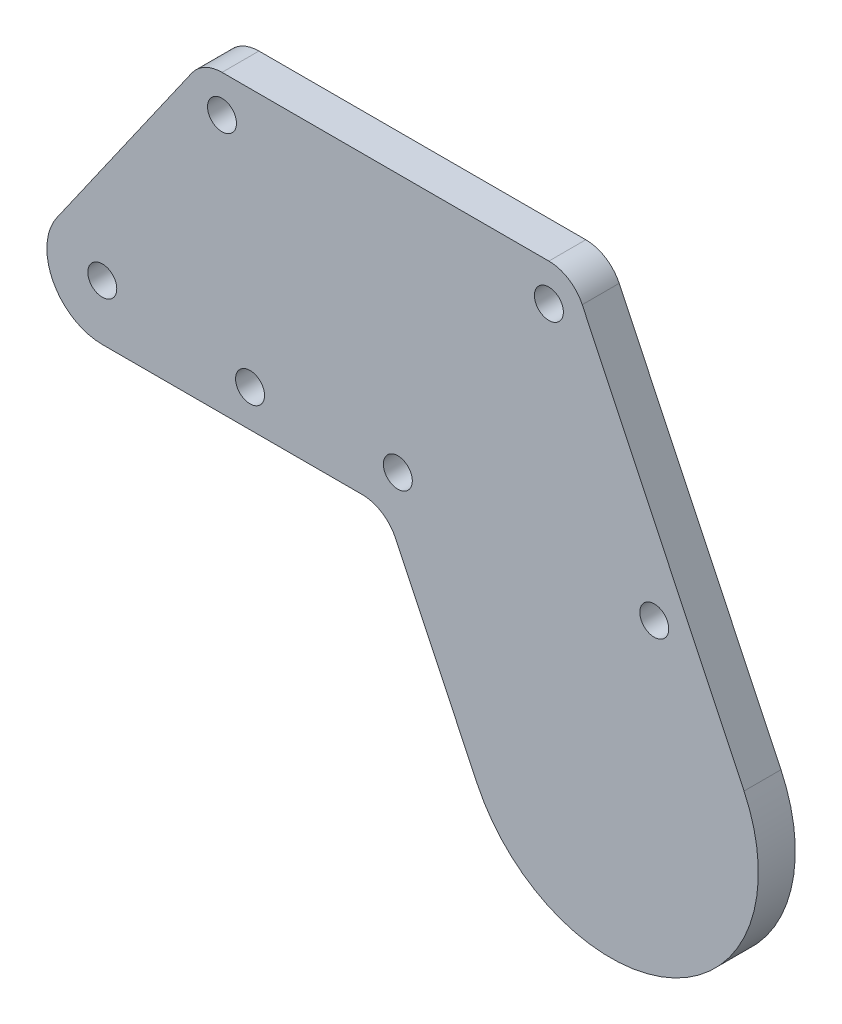
ISO-10303-21;
HEADER;
FILE_DESCRIPTION(('STEP AP214'),'2;1');
FILE_NAME('part.step','',(''),(''),'','','');
FILE_SCHEMA(('AUTOMOTIVE_DESIGN { 1 0 10303 214 1 1 1 1 }'));
ENDSEC;
DATA;
#1=APPLICATION_CONTEXT('core data for automotive mechanical design processes');
#2=APPLICATION_PROTOCOL_DEFINITION('international standard','automotive_design',2000,#1);
#3=PRODUCT_CONTEXT('',#1,'mechanical');
#4=PRODUCT('Part','Part','',(#3));
#5=PRODUCT_RELATED_PRODUCT_CATEGORY('part','',(#4));
#6=PRODUCT_DEFINITION_FORMATION('','',#4);
#7=PRODUCT_DEFINITION_CONTEXT('part definition',#1,'design');
#8=PRODUCT_DEFINITION('design','',#6,#7);
#9=PRODUCT_DEFINITION_SHAPE('','',#8);
#10=(LENGTH_UNIT() NAMED_UNIT(*) SI_UNIT(.MILLI.,.METRE.));
#11=(NAMED_UNIT(*) PLANE_ANGLE_UNIT() SI_UNIT($,.RADIAN.));
#12=(NAMED_UNIT(*) SI_UNIT($,.STERADIAN.) SOLID_ANGLE_UNIT());
#13=UNCERTAINTY_MEASURE_WITH_UNIT(LENGTH_MEASURE(1.E-05),#10,'distance_accuracy_value','');
#14=(GEOMETRIC_REPRESENTATION_CONTEXT(3) GLOBAL_UNCERTAINTY_ASSIGNED_CONTEXT((#13)) GLOBAL_UNIT_ASSIGNED_CONTEXT((#10,
#11,#12)) REPRESENTATION_CONTEXT('',''));
#15=CARTESIAN_POINT('',(0.,0.,0.));
#16=DIRECTION('',(0.,0.,1.));
#17=DIRECTION('',(1.,0.,0.));
#18=AXIS2_PLACEMENT_3D('',#15,#16,#17);
#19=CARTESIAN_POINT('',(569.9125,88.8999999999999,6.35));
#20=DIRECTION('',(0.,0.,1.));
#21=DIRECTION('',(1.,0.,0.));
#22=AXIS2_PLACEMENT_3D('',#19,#20,#21);
#23=PLANE('',#22);
#24=CARTESIAN_POINT('',(577.420232252986,117.475000000009,6.35));
#25=DIRECTION('',(0.,0.,1.));
#26=DIRECTION('',(1.,0.,0.));
#27=AXIS2_PLACEMENT_3D('',#24,#25,#26);
#28=CIRCLE('',#27,2.48919999999995);
#29=CARTESIAN_POINT('',(579.909432252986,117.475000000009,6.35));
#30=VERTEX_POINT('',#29);
#31=EDGE_CURVE('E240',#30,#30,#28,.T.);
#32=ORIENTED_EDGE('',*,*,#31,.F.);
#33=EDGE_LOOP('',(#32));
#34=FACE_BOUND('',#33,.T.);
#35=CARTESIAN_POINT('',(559.305908905092,155.575000002593,6.35));
#36=DIRECTION('',(0.,0.,1.));
#37=DIRECTION('',(1.,0.,0.));
#38=AXIS2_PLACEMENT_3D('',#35,#36,#37);
#39=CIRCLE('',#38,2.48919999999995);
#40=CARTESIAN_POINT('',(561.795108905092,155.575000002593,6.35));
#41=VERTEX_POINT('',#40);
#42=EDGE_CURVE('E228',#41,#41,#39,.T.);
#43=ORIENTED_EDGE('',*,*,#42,.F.);
#44=EDGE_LOOP('',(#43));
#45=FACE_BOUND('',#44,.T.);
#46=CARTESIAN_POINT('',(482.544825084848,120.650000000009,6.35));
#47=DIRECTION('',(0.,0.,1.));
#48=DIRECTION('',(1.,0.,0.));
#49=AXIS2_PLACEMENT_3D('',#46,#47,#48);
#50=CIRCLE('',#49,2.48920000000001);
#51=CARTESIAN_POINT('',(485.034025084848,120.650000000009,6.35));
#52=VERTEX_POINT('',#51);
#53=EDGE_CURVE('E156',#52,#52,#50,.T.);
#54=ORIENTED_EDGE('',*,*,#53,.F.);
#55=EDGE_LOOP('',(#54));
#56=FACE_BOUND('',#55,.T.);
#57=CARTESIAN_POINT('',(569.9125,88.8999999999999,6.35));
#58=DIRECTION('',(0.,0.,1.));
#59=DIRECTION('',(1.,0.,0.));
#60=AXIS2_PLACEMENT_3D('',#57,#58,#59);
#61=CIRCLE('',#60,25.4000000000025);
#62=CARTESIAN_POINT('',(546.973178459246,77.9936932351045,6.35));
#63=VERTEX_POINT('',#62);
#64=CARTESIAN_POINT('',(592.851821540755,99.8063067648954,6.35));
#65=VERTEX_POINT('',#64);
#66=EDGE_CURVE('E171',#63,#65,#61,.T.);
#67=ORIENTED_EDGE('',*,*,#66,.T.);
#68=DIRECTION('',(-0.429382156098203,0.903122895305206,0.));
#69=VECTOR('',#68,1.);
#70=CARTESIAN_POINT('',(592.851821540755,99.8063067648954,6.35));
#71=LINE('',#70,#69);
#72=CARTESIAN_POINT('',(565.040739290274,158.301576693813,6.35));
#73=VERTEX_POINT('',#72);
#74=EDGE_CURVE('E109',#65,#73,#71,.T.);
#75=ORIENTED_EDGE('',*,*,#74,.T.);
#76=CARTESIAN_POINT('',(559.305908905092,155.575000002593,6.35));
#77=DIRECTION('',(0.,0.,1.));
#78=DIRECTION('',(1.,0.,0.));
#79=AXIS2_PLACEMENT_3D('',#76,#77,#78);
#80=CIRCLE('',#79,6.34999999999367);
#81=CARTESIAN_POINT('',(559.305908905092,161.925000002586,6.35));
#82=VERTEX_POINT('',#81);
#83=EDGE_CURVE('E192',#73,#82,#80,.T.);
#84=ORIENTED_EDGE('',*,*,#83,.T.);
#85=DIRECTION('',(-1.,0.,0.));
#86=VECTOR('',#85,1.);
#87=CARTESIAN_POINT('',(559.305908905092,161.925000002586,6.35));
#88=LINE('',#87,#86);
#89=CARTESIAN_POINT('',(503.123614039306,161.925000002586,6.35));
#90=VERTEX_POINT('',#89);
#91=EDGE_CURVE('E211',#82,#90,#88,.T.);
#92=ORIENTED_EDGE('',*,*,#91,.T.);
#93=CARTESIAN_POINT('',(503.123614039306,155.575000002593,6.35));
#94=DIRECTION('',(0.,0.,1.));
#95=DIRECTION('',(1.,0.,0.));
#96=AXIS2_PLACEMENT_3D('',#93,#94,#95);
#97=CIRCLE('',#96,6.34999999999361);
#98=CARTESIAN_POINT('',(497.921998558076,159.217210373418,6.35));
#99=VERTEX_POINT('',#98);
#100=EDGE_CURVE('E208',#90,#99,#97,.T.);
#101=ORIENTED_EDGE('',*,*,#100,.T.);
#102=DIRECTION('',(-0.57357643635105,-0.819152044288989,0.));
#103=VECTOR('',#102,1.);
#104=CARTESIAN_POINT('',(497.921998558076,159.217210373418,6.35));
#105=LINE('',#104,#103);
#106=CARTESIAN_POINT('',(474.742401862995,126.113315556252,6.35));
#107=VERTEX_POINT('',#106);
#108=EDGE_CURVE('E210',#99,#107,#105,.T.);
#109=ORIENTED_EDGE('',*,*,#108,.T.);
#110=CARTESIAN_POINT('',(482.544825084848,120.650000000009,6.35));
#111=DIRECTION('',(0.,0.,1.));
#112=DIRECTION('',(1.,0.,0.));
#113=AXIS2_PLACEMENT_3D('',#110,#111,#112);
#114=CIRCLE('',#113,9.52500000000004);
#115=CARTESIAN_POINT('',(482.544825084848,111.125000000009,6.35));
#116=VERTEX_POINT('',#115);
#117=EDGE_CURVE('E134',#107,#116,#114,.T.);
#118=ORIENTED_EDGE('',*,*,#117,.T.);
#119=DIRECTION('',(1.,0.,0.));
#120=VECTOR('',#119,1.);
#121=CARTESIAN_POINT('',(482.544825084848,111.125000000009,6.35));
#122=LINE('',#121,#120);
#123=CARTESIAN_POINT('',(527.209074000565,111.125000000009,6.35));
#124=VERTEX_POINT('',#123);
#125=EDGE_CURVE('E128',#116,#124,#122,.T.);
#126=ORIENTED_EDGE('',*,*,#125,.T.);
#127=CARTESIAN_POINT('',(527.209074000564,104.775000000015,6.35));
#128=DIRECTION('',(0.,0.,-1.));
#129=DIRECTION('',(1.,0.,0.));
#130=AXIS2_PLACEMENT_3D('',#127,#128,#129);
#131=CIRCLE('',#130,6.34999999999369);
#132=CARTESIAN_POINT('',(532.943904385747,107.501576691236,6.35));
#133=VERTEX_POINT('',#132);
#134=EDGE_CURVE('E132',#124,#133,#131,.T.);
#135=ORIENTED_EDGE('',*,*,#134,.T.);
#136=DIRECTION('',(0.429382156098212,-0.903122895305202,0.));
#137=VECTOR('',#136,1.);
#138=CARTESIAN_POINT('',(532.943904385747,107.501576691236,6.35));
#139=LINE('',#138,#137);
#140=EDGE_CURVE('E60',#133,#63,#139,.T.);
#141=ORIENTED_EDGE('',*,*,#140,.T.);
#142=EDGE_LOOP('',(#67,#75,#84,#92,#101,#109,#118,#126,#135,#141));
#143=FACE_BOUND('',#142,.T.);
#144=CARTESIAN_POINT('',(503.123614039306,155.575000002593,6.35));
#145=DIRECTION('',(0.,0.,1.));
#146=DIRECTION('',(1.,0.,0.));
#147=AXIS2_PLACEMENT_3D('',#144,#145,#146);
#148=CIRCLE('',#147,2.48919999999995);
#149=CARTESIAN_POINT('',(505.612814039306,155.575000002593,6.35));
#150=VERTEX_POINT('',#149);
#151=EDGE_CURVE('E222',#150,#150,#148,.T.);
#152=ORIENTED_EDGE('',*,*,#151,.F.);
#153=EDGE_LOOP('',(#152));
#154=FACE_BOUND('',#153,.T.);
#155=CARTESIAN_POINT('',(533.344825084848,117.475000000009,6.35));
#156=DIRECTION('',(0.,0.,1.));
#157=DIRECTION('',(1.,0.,0.));
#158=AXIS2_PLACEMENT_3D('',#155,#156,#157);
#159=CIRCLE('',#158,2.48919999999995);
#160=CARTESIAN_POINT('',(535.834025084848,117.475000000009,6.35));
#161=VERTEX_POINT('',#160);
#162=EDGE_CURVE('E234',#161,#161,#159,.T.);
#163=ORIENTED_EDGE('',*,*,#162,.F.);
#164=EDGE_LOOP('',(#163));
#165=FACE_BOUND('',#164,.T.);
#166=CARTESIAN_POINT('',(507.944825084848,117.475000000009,6.35));
#167=DIRECTION('',(0.,0.,1.));
#168=DIRECTION('',(1.,0.,0.));
#169=AXIS2_PLACEMENT_3D('',#166,#167,#168);
#170=CIRCLE('',#169,2.48919999999995);
#171=CARTESIAN_POINT('',(510.434025084848,117.475000000009,6.35));
#172=VERTEX_POINT('',#171);
#173=EDGE_CURVE('E246',#172,#172,#170,.T.);
#174=ORIENTED_EDGE('',*,*,#173,.F.);
#175=EDGE_LOOP('',(#174));
#176=FACE_BOUND('',#175,.T.);
#177=ADVANCED_FACE('F43',(#34,#45,#56,#143,#154,#165,#176),#23,.T.);
#178=CARTESIAN_POINT('',(569.9125,88.8999999999999,0.));
#179=DIRECTION('',(0.,0.,1.));
#180=DIRECTION('',(1.,0.,0.));
#181=AXIS2_PLACEMENT_3D('',#178,#179,#180);
#182=PLANE('',#181);
#183=CARTESIAN_POINT('',(569.9125,88.8999999999999,0.));
#184=DIRECTION('',(0.,0.,1.));
#185=DIRECTION('',(1.,0.,0.));
#186=AXIS2_PLACEMENT_3D('',#183,#184,#185);
#187=CIRCLE('',#186,25.4000000000025);
#188=CARTESIAN_POINT('',(546.973178459246,77.9936932351045,0.));
#189=VERTEX_POINT('',#188);
#190=CARTESIAN_POINT('',(592.851821540755,99.8063067648954,0.));
#191=VERTEX_POINT('',#190);
#192=EDGE_CURVE('E152',#189,#191,#187,.T.);
#193=ORIENTED_EDGE('',*,*,#192,.F.);
#194=DIRECTION('',(0.429382156098212,-0.903122895305202,0.));
#195=VECTOR('',#194,1.);
#196=CARTESIAN_POINT('',(532.943904385747,107.501576691236,0.));
#197=LINE('',#196,#195);
#198=CARTESIAN_POINT('',(532.943904385747,107.501576691236,0.));
#199=VERTEX_POINT('',#198);
#200=EDGE_CURVE('E101',#199,#189,#197,.T.);
#201=ORIENTED_EDGE('',*,*,#200,.F.);
#202=CARTESIAN_POINT('',(527.209074000564,104.775000000015,0.));
#203=DIRECTION('',(0.,0.,-1.));
#204=DIRECTION('',(1.,0.,0.));
#205=AXIS2_PLACEMENT_3D('',#202,#203,#204);
#206=CIRCLE('',#205,6.34999999999369);
#207=CARTESIAN_POINT('',(527.209074000565,111.125000000009,0.));
#208=VERTEX_POINT('',#207);
#209=EDGE_CURVE('E95',#208,#199,#206,.T.);
#210=ORIENTED_EDGE('',*,*,#209,.F.);
#211=DIRECTION('',(1.,0.,0.));
#212=VECTOR('',#211,1.);
#213=CARTESIAN_POINT('',(482.544825084848,111.125000000009,0.));
#214=LINE('',#213,#212);
#215=CARTESIAN_POINT('',(482.544825084848,111.125000000009,0.));
#216=VERTEX_POINT('',#215);
#217=EDGE_CURVE('E142',#216,#208,#214,.T.);
#218=ORIENTED_EDGE('',*,*,#217,.F.);
#219=CARTESIAN_POINT('',(482.544825084848,120.650000000009,0.));
#220=DIRECTION('',(0.,0.,1.));
#221=DIRECTION('',(1.,0.,0.));
#222=AXIS2_PLACEMENT_3D('',#219,#220,#221);
#223=CIRCLE('',#222,9.52500000000004);
#224=CARTESIAN_POINT('',(474.742401862995,126.113315556252,0.));
#225=VERTEX_POINT('',#224);
#226=EDGE_CURVE('E166',#225,#216,#223,.T.);
#227=ORIENTED_EDGE('',*,*,#226,.F.);
#228=DIRECTION('',(-0.57357643635105,-0.819152044288989,0.));
#229=VECTOR('',#228,1.);
#230=CARTESIAN_POINT('',(497.921998558076,159.217210373418,0.));
#231=LINE('',#230,#229);
#232=CARTESIAN_POINT('',(497.921998558076,159.217210373418,0.));
#233=VERTEX_POINT('',#232);
#234=EDGE_CURVE('E164',#233,#225,#231,.T.);
#235=ORIENTED_EDGE('',*,*,#234,.F.);
#236=CARTESIAN_POINT('',(503.123614039306,155.575000002593,0.));
#237=DIRECTION('',(0.,0.,1.));
#238=DIRECTION('',(1.,0.,0.));
#239=AXIS2_PLACEMENT_3D('',#236,#237,#238);
#240=CIRCLE('',#239,6.34999999999361);
#241=CARTESIAN_POINT('',(503.123614039306,161.925000002586,0.));
#242=VERTEX_POINT('',#241);
#243=EDGE_CURVE('E162',#242,#233,#240,.T.);
#244=ORIENTED_EDGE('',*,*,#243,.F.);
#245=DIRECTION('',(-1.,0.,0.));
#246=VECTOR('',#245,1.);
#247=CARTESIAN_POINT('',(559.305908905092,161.925000002586,0.));
#248=LINE('',#247,#246);
#249=CARTESIAN_POINT('',(559.305908905092,161.925000002586,0.));
#250=VERTEX_POINT('',#249);
#251=EDGE_CURVE('E160',#250,#242,#248,.T.);
#252=ORIENTED_EDGE('',*,*,#251,.F.);
#253=CARTESIAN_POINT('',(559.305908905092,155.575000002593,0.));
#254=DIRECTION('',(0.,0.,1.));
#255=DIRECTION('',(1.,0.,0.));
#256=AXIS2_PLACEMENT_3D('',#253,#254,#255);
#257=CIRCLE('',#256,6.34999999999367);
#258=CARTESIAN_POINT('',(565.040739290274,158.301576693813,0.));
#259=VERTEX_POINT('',#258);
#260=EDGE_CURVE('E158',#259,#250,#257,.T.);
#261=ORIENTED_EDGE('',*,*,#260,.F.);
#262=DIRECTION('',(-0.429382156098203,0.903122895305206,0.));
#263=VECTOR('',#262,1.);
#264=CARTESIAN_POINT('',(592.851821540755,99.8063067648954,0.));
#265=LINE('',#264,#263);
#266=EDGE_CURVE('E155',#191,#259,#265,.T.);
#267=ORIENTED_EDGE('',*,*,#266,.F.);
#268=EDGE_LOOP('',(#193,#201,#210,#218,#227,#235,#244,#252,#261,#267));
#269=FACE_BOUND('',#268,.T.);
#270=CARTESIAN_POINT('',(482.544825084848,120.650000000009,0.));
#271=DIRECTION('',(0.,0.,1.));
#272=DIRECTION('',(1.,0.,0.));
#273=AXIS2_PLACEMENT_3D('',#270,#271,#272);
#274=CIRCLE('',#273,2.48920000000001);
#275=CARTESIAN_POINT('',(485.034025084848,120.650000000009,0.));
#276=VERTEX_POINT('',#275);
#277=EDGE_CURVE('E219',#276,#276,#274,.T.);
#278=ORIENTED_EDGE('',*,*,#277,.T.);
#279=EDGE_LOOP('',(#278));
#280=FACE_BOUND('',#279,.T.);
#281=CARTESIAN_POINT('',(503.123614039306,155.575000002593,0.));
#282=DIRECTION('',(0.,0.,1.));
#283=DIRECTION('',(1.,0.,0.));
#284=AXIS2_PLACEMENT_3D('',#281,#282,#283);
#285=CIRCLE('',#284,2.48919999999995);
#286=CARTESIAN_POINT('',(505.612814039306,155.575000002593,0.));
#287=VERTEX_POINT('',#286);
#288=EDGE_CURVE('E225',#287,#287,#285,.T.);
#289=ORIENTED_EDGE('',*,*,#288,.T.);
#290=EDGE_LOOP('',(#289));
#291=FACE_BOUND('',#290,.T.);
#292=CARTESIAN_POINT('',(559.305908905092,155.575000002593,0.));
#293=DIRECTION('',(0.,0.,1.));
#294=DIRECTION('',(1.,0.,0.));
#295=AXIS2_PLACEMENT_3D('',#292,#293,#294);
#296=CIRCLE('',#295,2.48919999999995);
#297=CARTESIAN_POINT('',(561.795108905092,155.575000002593,0.));
#298=VERTEX_POINT('',#297);
#299=EDGE_CURVE('E231',#298,#298,#296,.T.);
#300=ORIENTED_EDGE('',*,*,#299,.T.);
#301=EDGE_LOOP('',(#300));
#302=FACE_BOUND('',#301,.T.);
#303=CARTESIAN_POINT('',(533.344825084848,117.475000000009,0.));
#304=DIRECTION('',(0.,0.,1.));
#305=DIRECTION('',(1.,0.,0.));
#306=AXIS2_PLACEMENT_3D('',#303,#304,#305);
#307=CIRCLE('',#306,2.48919999999995);
#308=CARTESIAN_POINT('',(535.834025084848,117.475000000009,0.));
#309=VERTEX_POINT('',#308);
#310=EDGE_CURVE('E237',#309,#309,#307,.T.);
#311=ORIENTED_EDGE('',*,*,#310,.T.);
#312=EDGE_LOOP('',(#311));
#313=FACE_BOUND('',#312,.T.);
#314=CARTESIAN_POINT('',(577.420232252986,117.475000000009,0.));
#315=DIRECTION('',(0.,0.,1.));
#316=DIRECTION('',(1.,0.,0.));
#317=AXIS2_PLACEMENT_3D('',#314,#315,#316);
#318=CIRCLE('',#317,2.48919999999995);
#319=CARTESIAN_POINT('',(579.909432252986,117.475000000009,0.));
#320=VERTEX_POINT('',#319);
#321=EDGE_CURVE('E243',#320,#320,#318,.T.);
#322=ORIENTED_EDGE('',*,*,#321,.T.);
#323=EDGE_LOOP('',(#322));
#324=FACE_BOUND('',#323,.T.);
#325=CARTESIAN_POINT('',(507.944825084848,117.475000000009,0.));
#326=DIRECTION('',(0.,0.,1.));
#327=DIRECTION('',(1.,0.,0.));
#328=AXIS2_PLACEMENT_3D('',#325,#326,#327);
#329=CIRCLE('',#328,2.48919999999995);
#330=CARTESIAN_POINT('',(510.434025084848,117.475000000009,0.));
#331=VERTEX_POINT('',#330);
#332=EDGE_CURVE('E249',#331,#331,#329,.T.);
#333=ORIENTED_EDGE('',*,*,#332,.T.);
#334=EDGE_LOOP('',(#333));
#335=FACE_BOUND('',#334,.T.);
#336=ADVANCED_FACE('F196',(#269,#280,#291,#302,#313,#324,#335),#182,.F.);
#337=CARTESIAN_POINT('',(569.9125,88.8999999999999,6.35));
#338=DIRECTION('',(0.,0.,-1.));
#339=DIRECTION('',(-1.,0.,0.));
#340=AXIS2_PLACEMENT_3D('',#337,#338,#339);
#341=CYLINDRICAL_SURFACE('',#340,25.4000000000025);
#342=ORIENTED_EDGE('',*,*,#192,.T.);
#343=DIRECTION('',(0.,0.,-1.));
#344=VECTOR('',#343,1.);
#345=CARTESIAN_POINT('',(592.851821540755,99.8063067648954,6.35));
#346=LINE('',#345,#344);
#347=EDGE_CURVE('E11',#65,#191,#346,.T.);
#348=ORIENTED_EDGE('',*,*,#347,.F.);
#349=ORIENTED_EDGE('',*,*,#66,.F.);
#350=DIRECTION('',(0.,0.,-1.));
#351=VECTOR('',#350,1.);
#352=CARTESIAN_POINT('',(546.973178459246,77.9936932351045,6.35));
#353=LINE('',#352,#351);
#354=EDGE_CURVE('E148',#63,#189,#353,.T.);
#355=ORIENTED_EDGE('',*,*,#354,.T.);
#356=EDGE_LOOP('',(#342,#348,#349,#355));
#357=FACE_BOUND('',#356,.T.);
#358=ADVANCED_FACE('F45',(#357),#341,.T.);
#359=CARTESIAN_POINT('',(592.851821540755,99.8063067648954,6.35));
#360=DIRECTION('',(-0.903122895305206,-0.429382156098203,0.));
#361=DIRECTION('',(0.429382156098203,-0.903122895305206,0.));
#362=AXIS2_PLACEMENT_3D('',#359,#360,#361);
#363=PLANE('',#362);
#364=ORIENTED_EDGE('',*,*,#266,.T.);
#365=DIRECTION('',(0.,0.,-1.));
#366=VECTOR('',#365,1.);
#367=CARTESIAN_POINT('',(565.040739290274,158.301576693813,6.35));
#368=LINE('',#367,#366);
#369=EDGE_CURVE('E52',#73,#259,#368,.T.);
#370=ORIENTED_EDGE('',*,*,#369,.F.);
#371=ORIENTED_EDGE('',*,*,#74,.F.);
#372=ORIENTED_EDGE('',*,*,#347,.T.);
#373=EDGE_LOOP('',(#364,#370,#371,#372));
#374=FACE_BOUND('',#373,.T.);
#375=ADVANCED_FACE('F291',(#374),#363,.F.);
#376=CARTESIAN_POINT('',(559.305908905092,155.575000002593,6.35));
#377=DIRECTION('',(0.,0.,-1.));
#378=DIRECTION('',(-1.,0.,0.));
#379=AXIS2_PLACEMENT_3D('',#376,#377,#378);
#380=CYLINDRICAL_SURFACE('',#379,6.34999999999367);
#381=ORIENTED_EDGE('',*,*,#260,.T.);
#382=DIRECTION('',(0.,0.,-1.));
#383=VECTOR('',#382,1.);
#384=CARTESIAN_POINT('',(559.305908905092,161.925000002586,6.35));
#385=LINE('',#384,#383);
#386=EDGE_CURVE('E184',#82,#250,#385,.T.);
#387=ORIENTED_EDGE('',*,*,#386,.F.);
#388=ORIENTED_EDGE('',*,*,#83,.F.);
#389=ORIENTED_EDGE('',*,*,#369,.T.);
#390=EDGE_LOOP('',(#381,#387,#388,#389));
#391=FACE_BOUND('',#390,.T.);
#392=ADVANCED_FACE('F190',(#391),#380,.T.);
#393=CARTESIAN_POINT('',(559.305908905092,161.925000002586,6.35));
#394=DIRECTION('',(0.,-1.,0.));
#395=DIRECTION('',(1.,0.,0.));
#396=AXIS2_PLACEMENT_3D('',#393,#394,#395);
#397=PLANE('',#396);
#398=ORIENTED_EDGE('',*,*,#251,.T.);
#399=DIRECTION('',(0.,0.,-1.));
#400=VECTOR('',#399,1.);
#401=CARTESIAN_POINT('',(503.123614039306,161.925000002586,6.35));
#402=LINE('',#401,#400);
#403=EDGE_CURVE('E181',#90,#242,#402,.T.);
#404=ORIENTED_EDGE('',*,*,#403,.F.);
#405=ORIENTED_EDGE('',*,*,#91,.F.);
#406=ORIENTED_EDGE('',*,*,#386,.T.);
#407=EDGE_LOOP('',(#398,#404,#405,#406));
#408=FACE_BOUND('',#407,.T.);
#409=ADVANCED_FACE('F202',(#408),#397,.F.);
#410=CARTESIAN_POINT('',(503.123614039306,155.575000002593,6.35));
#411=DIRECTION('',(0.,0.,-1.));
#412=DIRECTION('',(-1.,0.,0.));
#413=AXIS2_PLACEMENT_3D('',#410,#411,#412);
#414=CYLINDRICAL_SURFACE('',#413,6.34999999999361);
#415=ORIENTED_EDGE('',*,*,#243,.T.);
#416=DIRECTION('',(0.,0.,-1.));
#417=VECTOR('',#416,1.);
#418=CARTESIAN_POINT('',(497.921998558076,159.217210373418,6.35));
#419=LINE('',#418,#417);
#420=EDGE_CURVE('E178',#99,#233,#419,.T.);
#421=ORIENTED_EDGE('',*,*,#420,.F.);
#422=ORIENTED_EDGE('',*,*,#100,.F.);
#423=ORIENTED_EDGE('',*,*,#403,.T.);
#424=EDGE_LOOP('',(#415,#421,#422,#423));
#425=FACE_BOUND('',#424,.T.);
#426=ADVANCED_FACE('F206',(#425),#414,.T.);
#427=CARTESIAN_POINT('',(497.921998558076,159.217210373418,6.35));
#428=DIRECTION('',(0.819152044288989,-0.57357643635105,0.));
#429=DIRECTION('',(0.57357643635105,0.819152044288989,0.));
#430=AXIS2_PLACEMENT_3D('',#427,#428,#429);
#431=PLANE('',#430);
#432=ORIENTED_EDGE('',*,*,#234,.T.);
#433=DIRECTION('',(0.,0.,-1.));
#434=VECTOR('',#433,1.);
#435=CARTESIAN_POINT('',(474.742401862995,126.113315556252,6.35));
#436=LINE('',#435,#434);
#437=EDGE_CURVE('E175',#107,#225,#436,.T.);
#438=ORIENTED_EDGE('',*,*,#437,.F.);
#439=ORIENTED_EDGE('',*,*,#108,.F.);
#440=ORIENTED_EDGE('',*,*,#420,.T.);
#441=EDGE_LOOP('',(#432,#438,#439,#440));
#442=FACE_BOUND('',#441,.T.);
#443=ADVANCED_FACE('F281',(#442),#431,.F.);
#444=CARTESIAN_POINT('',(482.544825084848,120.650000000009,6.35));
#445=DIRECTION('',(0.,0.,-1.));
#446=DIRECTION('',(-1.,0.,0.));
#447=AXIS2_PLACEMENT_3D('',#444,#445,#446);
#448=CYLINDRICAL_SURFACE('',#447,9.52500000000004);
#449=ORIENTED_EDGE('',*,*,#226,.T.);
#450=DIRECTION('',(0.,0.,-1.));
#451=VECTOR('',#450,1.);
#452=CARTESIAN_POINT('',(482.544825084848,111.125000000009,6.35));
#453=LINE('',#452,#451);
#454=EDGE_CURVE('E143',#116,#216,#453,.T.);
#455=ORIENTED_EDGE('',*,*,#454,.F.);
#456=ORIENTED_EDGE('',*,*,#117,.F.);
#457=ORIENTED_EDGE('',*,*,#437,.T.);
#458=EDGE_LOOP('',(#449,#455,#456,#457));
#459=FACE_BOUND('',#458,.T.);
#460=ADVANCED_FACE('F278',(#459),#448,.T.);
#461=CARTESIAN_POINT('',(482.544825084848,111.125000000009,6.35));
#462=DIRECTION('',(0.,1.,0.));
#463=DIRECTION('',(-1.,0.,0.));
#464=AXIS2_PLACEMENT_3D('',#461,#462,#463);
#465=PLANE('',#464);
#466=ORIENTED_EDGE('',*,*,#217,.T.);
#467=DIRECTION('',(0.,0.,-1.));
#468=VECTOR('',#467,1.);
#469=CARTESIAN_POINT('',(527.209074000565,111.125000000009,6.35));
#470=LINE('',#469,#468);
#471=EDGE_CURVE('E139',#124,#208,#470,.T.);
#472=ORIENTED_EDGE('',*,*,#471,.F.);
#473=ORIENTED_EDGE('',*,*,#125,.F.);
#474=ORIENTED_EDGE('',*,*,#454,.T.);
#475=EDGE_LOOP('',(#466,#472,#473,#474));
#476=FACE_BOUND('',#475,.T.);
#477=ADVANCED_FACE('F140',(#476),#465,.F.);
#478=CARTESIAN_POINT('',(527.209074000564,104.775000000015,6.35));
#479=DIRECTION('',(0.,0.,-1.));
#480=DIRECTION('',(-1.,0.,0.));
#481=AXIS2_PLACEMENT_3D('',#478,#479,#480);
#482=CYLINDRICAL_SURFACE('',#481,6.34999999999369);
#483=ORIENTED_EDGE('',*,*,#209,.T.);
#484=DIRECTION('',(0.,0.,-1.));
#485=VECTOR('',#484,1.);
#486=CARTESIAN_POINT('',(532.943904385747,107.501576691236,6.35));
#487=LINE('',#486,#485);
#488=EDGE_CURVE('E144',#133,#199,#487,.T.);
#489=ORIENTED_EDGE('',*,*,#488,.F.);
#490=ORIENTED_EDGE('',*,*,#134,.F.);
#491=ORIENTED_EDGE('',*,*,#471,.T.);
#492=EDGE_LOOP('',(#483,#489,#490,#491));
#493=FACE_BOUND('',#492,.T.);
#494=ADVANCED_FACE('F146',(#493),#482,.F.);
#495=CARTESIAN_POINT('',(532.943904385747,107.501576691236,6.35));
#496=DIRECTION('',(0.903122895305202,0.429382156098212,0.));
#497=DIRECTION('',(-0.429382156098212,0.903122895305202,0.));
#498=AXIS2_PLACEMENT_3D('',#495,#496,#497);
#499=PLANE('',#498);
#500=ORIENTED_EDGE('',*,*,#200,.T.);
#501=ORIENTED_EDGE('',*,*,#354,.F.);
#502=ORIENTED_EDGE('',*,*,#140,.F.);
#503=ORIENTED_EDGE('',*,*,#488,.T.);
#504=EDGE_LOOP('',(#500,#501,#502,#503));
#505=FACE_BOUND('',#504,.T.);
#506=ADVANCED_FACE('F271',(#505),#499,.F.);
#507=CARTESIAN_POINT('',(482.544825084848,120.650000000009,6.35));
#508=DIRECTION('',(0.,0.,-1.));
#509=DIRECTION('',(-1.,0.,0.));
#510=AXIS2_PLACEMENT_3D('',#507,#508,#509);
#511=CYLINDRICAL_SURFACE('',#510,2.48920000000001);
#512=ORIENTED_EDGE('',*,*,#53,.T.);
#513=EDGE_LOOP('',(#512));
#514=FACE_BOUND('',#513,.T.);
#515=ORIENTED_EDGE('',*,*,#277,.F.);
#516=EDGE_LOOP('',(#515));
#517=FACE_BOUND('',#516,.T.);
#518=ADVANCED_FACE('F268',(#514,#517),#511,.F.);
#519=CARTESIAN_POINT('',(503.123614039306,155.575000002593,6.35));
#520=DIRECTION('',(0.,0.,-1.));
#521=DIRECTION('',(-1.,0.,0.));
#522=AXIS2_PLACEMENT_3D('',#519,#520,#521);
#523=CYLINDRICAL_SURFACE('',#522,2.48919999999995);
#524=ORIENTED_EDGE('',*,*,#151,.T.);
#525=EDGE_LOOP('',(#524));
#526=FACE_BOUND('',#525,.T.);
#527=ORIENTED_EDGE('',*,*,#288,.F.);
#528=EDGE_LOOP('',(#527));
#529=FACE_BOUND('',#528,.T.);
#530=ADVANCED_FACE('F366',(#526,#529),#523,.F.);
#531=CARTESIAN_POINT('',(559.305908905092,155.575000002593,6.35));
#532=DIRECTION('',(0.,0.,-1.));
#533=DIRECTION('',(-1.,0.,0.));
#534=AXIS2_PLACEMENT_3D('',#531,#532,#533);
#535=CYLINDRICAL_SURFACE('',#534,2.48919999999995);
#536=ORIENTED_EDGE('',*,*,#42,.T.);
#537=EDGE_LOOP('',(#536));
#538=FACE_BOUND('',#537,.T.);
#539=ORIENTED_EDGE('',*,*,#299,.F.);
#540=EDGE_LOOP('',(#539));
#541=FACE_BOUND('',#540,.T.);
#542=ADVANCED_FACE('F374',(#538,#541),#535,.F.);
#543=CARTESIAN_POINT('',(533.344825084848,117.475000000009,6.35));
#544=DIRECTION('',(0.,0.,-1.));
#545=DIRECTION('',(-1.,0.,0.));
#546=AXIS2_PLACEMENT_3D('',#543,#544,#545);
#547=CYLINDRICAL_SURFACE('',#546,2.48919999999995);
#548=ORIENTED_EDGE('',*,*,#162,.T.);
#549=EDGE_LOOP('',(#548));
#550=FACE_BOUND('',#549,.T.);
#551=ORIENTED_EDGE('',*,*,#310,.F.);
#552=EDGE_LOOP('',(#551));
#553=FACE_BOUND('',#552,.T.);
#554=ADVANCED_FACE('F382',(#550,#553),#547,.F.);
#555=CARTESIAN_POINT('',(577.420232252986,117.475000000009,6.35));
#556=DIRECTION('',(0.,0.,-1.));
#557=DIRECTION('',(-1.,0.,0.));
#558=AXIS2_PLACEMENT_3D('',#555,#556,#557);
#559=CYLINDRICAL_SURFACE('',#558,2.48919999999995);
#560=ORIENTED_EDGE('',*,*,#31,.T.);
#561=EDGE_LOOP('',(#560));
#562=FACE_BOUND('',#561,.T.);
#563=ORIENTED_EDGE('',*,*,#321,.F.);
#564=EDGE_LOOP('',(#563));
#565=FACE_BOUND('',#564,.T.);
#566=ADVANCED_FACE('F391',(#562,#565),#559,.F.);
#567=CARTESIAN_POINT('',(507.944825084848,117.475000000009,6.35));
#568=DIRECTION('',(0.,0.,-1.));
#569=DIRECTION('',(-1.,0.,0.));
#570=AXIS2_PLACEMENT_3D('',#567,#568,#569);
#571=CYLINDRICAL_SURFACE('',#570,2.48919999999995);
#572=ORIENTED_EDGE('',*,*,#173,.T.);
#573=EDGE_LOOP('',(#572));
#574=FACE_BOUND('',#573,.T.);
#575=ORIENTED_EDGE('',*,*,#332,.F.);
#576=EDGE_LOOP('',(#575));
#577=FACE_BOUND('',#576,.T.);
#578=ADVANCED_FACE('F255',(#574,#577),#571,.F.);
#579=CLOSED_SHELL('',(#177,#336,#358,#375,#392,#409,#426,#443,#460,#477,#494,#506,#518,#530,
#542,#554,#566,#578));
#580=MANIFOLD_SOLID_BREP('B2',#579);
#581=ADVANCED_BREP_SHAPE_REPRESENTATION('',(#18,#580),#14);
#582=SHAPE_DEFINITION_REPRESENTATION(#9,#581);
ENDSEC;
END-ISO-10303-21;
